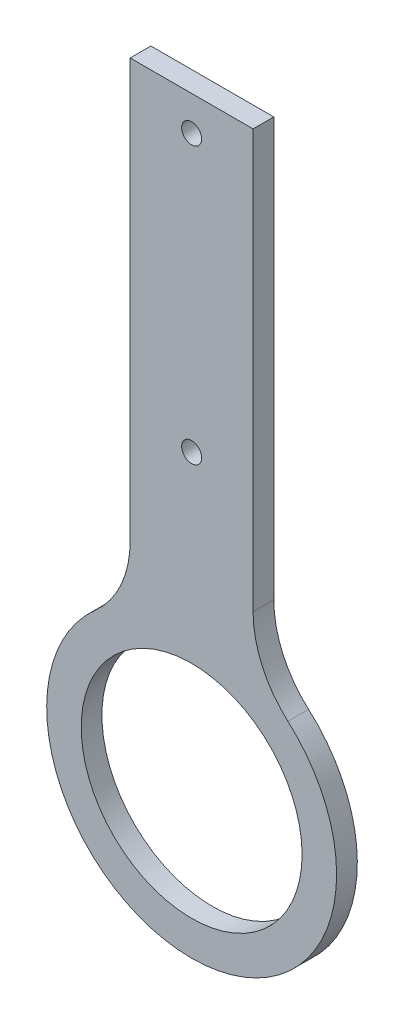
ISO-10303-21;
HEADER;
FILE_DESCRIPTION(('STEP AP214'),'2;1');
FILE_NAME('part.step','',(''),(''),'','','');
FILE_SCHEMA(('AUTOMOTIVE_DESIGN { 1 0 10303 214 1 1 1 1 }'));
ENDSEC;
DATA;
#1=APPLICATION_CONTEXT('core data for automotive mechanical design processes');
#2=APPLICATION_PROTOCOL_DEFINITION('international standard','automotive_design',2000,#1);
#3=PRODUCT_CONTEXT('',#1,'mechanical');
#4=PRODUCT('Part','Part','',(#3));
#5=PRODUCT_RELATED_PRODUCT_CATEGORY('part','',(#4));
#6=PRODUCT_DEFINITION_FORMATION('','',#4);
#7=PRODUCT_DEFINITION_CONTEXT('part definition',#1,'design');
#8=PRODUCT_DEFINITION('design','',#6,#7);
#9=PRODUCT_DEFINITION_SHAPE('','',#8);
#10=(LENGTH_UNIT() NAMED_UNIT(*) SI_UNIT(.MILLI.,.METRE.));
#11=(NAMED_UNIT(*) PLANE_ANGLE_UNIT() SI_UNIT($,.RADIAN.));
#12=(NAMED_UNIT(*) SI_UNIT($,.STERADIAN.) SOLID_ANGLE_UNIT());
#13=UNCERTAINTY_MEASURE_WITH_UNIT(LENGTH_MEASURE(1.E-05),#10,'distance_accuracy_value','');
#14=(GEOMETRIC_REPRESENTATION_CONTEXT(3) GLOBAL_UNCERTAINTY_ASSIGNED_CONTEXT((#13)) GLOBAL_UNIT_ASSIGNED_CONTEXT((#10,
#11,#12)) REPRESENTATION_CONTEXT('',''));
#15=CARTESIAN_POINT('',(0.,0.,0.));
#16=DIRECTION('',(0.,0.,1.));
#17=DIRECTION('',(1.,0.,0.));
#18=AXIS2_PLACEMENT_3D('',#15,#16,#17);
#19=CARTESIAN_POINT('',(0.,0.,3.));
#20=DIRECTION('',(0.,0.,-1.));
#21=DIRECTION('',(-1.,0.,0.));
#22=AXIS2_PLACEMENT_3D('',#19,#20,#21);
#23=CYLINDRICAL_SURFACE('',#22,21.);
#24=CARTESIAN_POINT('',(0.,0.,3.));
#25=DIRECTION('',(0.,0.,1.));
#26=DIRECTION('',(1.,0.,0.));
#27=AXIS2_PLACEMENT_3D('',#24,#25,#26);
#28=CIRCLE('',#27,21.);
#29=CARTESIAN_POINT('',(-13.9416666666667,15.7044557548345,3.));
#30=VERTEX_POINT('',#29);
#31=CARTESIAN_POINT('',(13.9416666666667,15.7044557548345,3.));
#32=VERTEX_POINT('',#31);
#33=EDGE_CURVE('E136',#30,#32,#28,.T.);
#34=ORIENTED_EDGE('',*,*,#33,.F.);
#35=DIRECTION('',(0.,0.,-1.));
#36=VECTOR('',#35,1.);
#37=CARTESIAN_POINT('',(-13.9416666666667,15.7044557548345,3.));
#38=LINE('',#37,#36);
#39=CARTESIAN_POINT('',(-13.9416666666667,15.7044557548345,0.));
#40=VERTEX_POINT('',#39);
#41=EDGE_CURVE('E149',#30,#40,#38,.T.);
#42=ORIENTED_EDGE('',*,*,#41,.T.);
#43=CARTESIAN_POINT('',(0.,0.,0.));
#44=DIRECTION('',(0.,0.,1.));
#45=DIRECTION('',(1.,0.,0.));
#46=AXIS2_PLACEMENT_3D('',#43,#44,#45);
#47=CIRCLE('',#46,21.);
#48=CARTESIAN_POINT('',(13.9416666666667,15.7044557548345,0.));
#49=VERTEX_POINT('',#48);
#50=EDGE_CURVE('E134',#40,#49,#47,.T.);
#51=ORIENTED_EDGE('',*,*,#50,.T.);
#52=DIRECTION('',(0.,0.,-1.));
#53=VECTOR('',#52,1.);
#54=CARTESIAN_POINT('',(13.9416666666667,15.7044557548345,3.));
#55=LINE('',#54,#53);
#56=EDGE_CURVE('E146',#49,#32,#55,.F.);
#57=ORIENTED_EDGE('',*,*,#56,.T.);
#58=EDGE_LOOP('',(#34,#42,#51,#57));
#59=FACE_BOUND('',#58,.T.);
#60=ADVANCED_FACE('F45',(#59),#23,.T.);
#61=CARTESIAN_POINT('',(0.,0.,3.));
#62=DIRECTION('',(0.,0.,-1.));
#63=DIRECTION('',(-1.,0.,0.));
#64=AXIS2_PLACEMENT_3D('',#61,#62,#63);
#65=CYLINDRICAL_SURFACE('',#64,16.);
#66=CARTESIAN_POINT('',(0.,0.,0.));
#67=DIRECTION('',(0.,0.,1.));
#68=DIRECTION('',(1.,0.,0.));
#69=AXIS2_PLACEMENT_3D('',#66,#67,#68);
#70=CIRCLE('',#69,16.);
#71=CARTESIAN_POINT('',(16.,0.,0.));
#72=VERTEX_POINT('',#71);
#73=EDGE_CURVE('E122',#72,#72,#70,.T.);
#74=ORIENTED_EDGE('',*,*,#73,.F.);
#75=EDGE_LOOP('',(#74));
#76=FACE_BOUND('',#75,.T.);
#77=CARTESIAN_POINT('',(0.,0.,3.));
#78=DIRECTION('',(0.,0.,1.));
#79=DIRECTION('',(1.,0.,0.));
#80=AXIS2_PLACEMENT_3D('',#77,#78,#79);
#81=CIRCLE('',#80,16.);
#82=CARTESIAN_POINT('',(16.,0.,3.));
#83=VERTEX_POINT('',#82);
#84=EDGE_CURVE('E127',#83,#83,#81,.T.);
#85=ORIENTED_EDGE('',*,*,#84,.T.);
#86=EDGE_LOOP('',(#85));
#87=FACE_BOUND('',#86,.T.);
#88=ADVANCED_FACE('F177',(#76,#87),#65,.F.);
#89=CARTESIAN_POINT('',(0.,0.,3.));
#90=DIRECTION('',(0.,0.,1.));
#91=DIRECTION('',(1.,0.,0.));
#92=AXIS2_PLACEMENT_3D('',#89,#90,#91);
#93=PLANE('',#92);
#94=ORIENTED_EDGE('',*,*,#84,.F.);
#95=EDGE_LOOP('',(#94));
#96=FACE_BOUND('',#95,.T.);
#97=DIRECTION('',(0.,-1.,0.));
#98=VECTOR('',#97,1.);
#99=CARTESIAN_POINT('',(-8.9,12.5,3.));
#100=LINE('',#99,#98);
#101=CARTESIAN_POINT('',(-8.9,87.5,3.));
#102=VERTEX_POINT('',#101);
#103=CARTESIAN_POINT('',(-8.9,26.9219241511449,3.));
#104=VERTEX_POINT('',#103);
#105=EDGE_CURVE('E115',#102,#104,#100,.T.);
#106=ORIENTED_EDGE('',*,*,#105,.T.);
#107=CARTESIAN_POINT('',(-23.9,26.9219241511449,3.));
#108=DIRECTION('',(0.,0.,1.));
#109=DIRECTION('',(1.,0.,0.));
#110=AXIS2_PLACEMENT_3D('',#107,#108,#109);
#111=CIRCLE('',#110,15.);
#112=EDGE_CURVE('E155',#104,#30,#111,.F.);
#113=ORIENTED_EDGE('',*,*,#112,.T.);
#114=ORIENTED_EDGE('',*,*,#33,.T.);
#115=CARTESIAN_POINT('',(23.9,26.9219241511449,3.));
#116=DIRECTION('',(0.,0.,1.));
#117=DIRECTION('',(1.,0.,0.));
#118=AXIS2_PLACEMENT_3D('',#115,#116,#117);
#119=CIRCLE('',#118,15.);
#120=CARTESIAN_POINT('',(8.9,26.9219241511449,3.));
#121=VERTEX_POINT('',#120);
#122=EDGE_CURVE('E11',#32,#121,#119,.F.);
#123=ORIENTED_EDGE('',*,*,#122,.T.);
#124=DIRECTION('',(0.,1.,0.));
#125=VECTOR('',#124,1.);
#126=CARTESIAN_POINT('',(8.9,12.5,3.));
#127=LINE('',#126,#125);
#128=CARTESIAN_POINT('',(8.9,87.5,3.));
#129=VERTEX_POINT('',#128);
#130=EDGE_CURVE('E95',#121,#129,#127,.T.);
#131=ORIENTED_EDGE('',*,*,#130,.T.);
#132=DIRECTION('',(-1.,0.,0.));
#133=VECTOR('',#132,1.);
#134=CARTESIAN_POINT('',(-8.9,87.5,3.));
#135=LINE('',#134,#133);
#136=EDGE_CURVE('E100',#129,#102,#135,.T.);
#137=ORIENTED_EDGE('',*,*,#136,.T.);
#138=EDGE_LOOP('',(#106,#113,#114,#123,#131,#137));
#139=FACE_BOUND('',#138,.T.);
#140=CARTESIAN_POINT('',(0.,42.5,3.));
#141=DIRECTION('',(0.,0.,1.));
#142=DIRECTION('',(1.,0.,0.));
#143=AXIS2_PLACEMENT_3D('',#140,#141,#142);
#144=CIRCLE('',#143,1.45);
#145=CARTESIAN_POINT('',(1.45,42.5,3.));
#146=VERTEX_POINT('',#145);
#147=EDGE_CURVE('E221',#146,#146,#144,.T.);
#148=ORIENTED_EDGE('',*,*,#147,.F.);
#149=EDGE_LOOP('',(#148));
#150=FACE_BOUND('',#149,.T.);
#151=CARTESIAN_POINT('',(0.,82.5,3.));
#152=DIRECTION('',(0.,0.,1.));
#153=DIRECTION('',(1.,0.,0.));
#154=AXIS2_PLACEMENT_3D('',#151,#152,#153);
#155=CIRCLE('',#154,1.45);
#156=CARTESIAN_POINT('',(1.45,82.5,3.));
#157=VERTEX_POINT('',#156);
#158=EDGE_CURVE('E210',#157,#157,#155,.T.);
#159=ORIENTED_EDGE('',*,*,#158,.F.);
#160=EDGE_LOOP('',(#159));
#161=FACE_BOUND('',#160,.T.);
#162=ADVANCED_FACE('F98',(#96,#139,#150,#161),#93,.T.);
#163=CARTESIAN_POINT('',(0.,0.,0.));
#164=DIRECTION('',(0.,0.,1.));
#165=DIRECTION('',(1.,0.,0.));
#166=AXIS2_PLACEMENT_3D('',#163,#164,#165);
#167=PLANE('',#166);
#168=ORIENTED_EDGE('',*,*,#73,.T.);
#169=EDGE_LOOP('',(#168));
#170=FACE_BOUND('',#169,.T.);
#171=DIRECTION('',(0.,1.,0.));
#172=VECTOR('',#171,1.);
#173=CARTESIAN_POINT('',(8.9,12.5,0.));
#174=LINE('',#173,#172);
#175=CARTESIAN_POINT('',(8.9,26.9219241511449,0.));
#176=VERTEX_POINT('',#175);
#177=CARTESIAN_POINT('',(8.9,87.5,0.));
#178=VERTEX_POINT('',#177);
#179=EDGE_CURVE('E119',#176,#178,#174,.T.);
#180=ORIENTED_EDGE('',*,*,#179,.F.);
#181=CARTESIAN_POINT('',(23.9,26.9219241511449,0.));
#182=DIRECTION('',(0.,0.,1.));
#183=DIRECTION('',(1.,0.,0.));
#184=AXIS2_PLACEMENT_3D('',#181,#182,#183);
#185=CIRCLE('',#184,15.);
#186=EDGE_CURVE('E54',#176,#49,#185,.T.);
#187=ORIENTED_EDGE('',*,*,#186,.T.);
#188=ORIENTED_EDGE('',*,*,#50,.F.);
#189=CARTESIAN_POINT('',(-23.9,26.9219241511449,0.));
#190=DIRECTION('',(0.,0.,1.));
#191=DIRECTION('',(1.,0.,0.));
#192=AXIS2_PLACEMENT_3D('',#189,#190,#191);
#193=CIRCLE('',#192,15.);
#194=CARTESIAN_POINT('',(-8.9,26.9219241511449,0.));
#195=VERTEX_POINT('',#194);
#196=EDGE_CURVE('E158',#40,#195,#193,.T.);
#197=ORIENTED_EDGE('',*,*,#196,.T.);
#198=DIRECTION('',(0.,-1.,0.));
#199=VECTOR('',#198,1.);
#200=CARTESIAN_POINT('',(-8.9,12.5,0.));
#201=LINE('',#200,#199);
#202=CARTESIAN_POINT('',(-8.9,87.5,0.));
#203=VERTEX_POINT('',#202);
#204=EDGE_CURVE('E105',#203,#195,#201,.T.);
#205=ORIENTED_EDGE('',*,*,#204,.F.);
#206=DIRECTION('',(-1.,0.,0.));
#207=VECTOR('',#206,1.);
#208=CARTESIAN_POINT('',(-8.9,87.5,0.));
#209=LINE('',#208,#207);
#210=EDGE_CURVE('E232',#178,#203,#209,.T.);
#211=ORIENTED_EDGE('',*,*,#210,.F.);
#212=EDGE_LOOP('',(#180,#187,#188,#197,#205,#211));
#213=FACE_BOUND('',#212,.T.);
#214=CARTESIAN_POINT('',(0.,42.5,0.));
#215=DIRECTION('',(0.,0.,1.));
#216=DIRECTION('',(1.,0.,0.));
#217=AXIS2_PLACEMENT_3D('',#214,#215,#216);
#218=CIRCLE('',#217,1.45);
#219=CARTESIAN_POINT('',(1.45,42.5,0.));
#220=VERTEX_POINT('',#219);
#221=EDGE_CURVE('E218',#220,#220,#218,.T.);
#222=ORIENTED_EDGE('',*,*,#221,.T.);
#223=EDGE_LOOP('',(#222));
#224=FACE_BOUND('',#223,.T.);
#225=CARTESIAN_POINT('',(0.,82.5,0.));
#226=DIRECTION('',(0.,0.,1.));
#227=DIRECTION('',(1.,0.,0.));
#228=AXIS2_PLACEMENT_3D('',#225,#226,#227);
#229=CIRCLE('',#228,1.45);
#230=CARTESIAN_POINT('',(1.45,82.5,0.));
#231=VERTEX_POINT('',#230);
#232=EDGE_CURVE('E213',#231,#231,#229,.T.);
#233=ORIENTED_EDGE('',*,*,#232,.T.);
#234=EDGE_LOOP('',(#233));
#235=FACE_BOUND('',#234,.T.);
#236=ADVANCED_FACE('F163',(#170,#213,#224,#235),#167,.F.);
#237=CARTESIAN_POINT('',(8.9,12.5,3.));
#238=DIRECTION('',(-1.,0.,0.));
#239=DIRECTION('',(0.,0.,1.));
#240=AXIS2_PLACEMENT_3D('',#237,#238,#239);
#241=PLANE('',#240);
#242=ORIENTED_EDGE('',*,*,#130,.F.);
#243=DIRECTION('',(0.,0.,1.));
#244=VECTOR('',#243,1.);
#245=CARTESIAN_POINT('',(8.9,26.9219241511449,0.));
#246=LINE('',#245,#244);
#247=EDGE_CURVE('E152',#121,#176,#246,.F.);
#248=ORIENTED_EDGE('',*,*,#247,.T.);
#249=ORIENTED_EDGE('',*,*,#179,.T.);
#250=DIRECTION('',(0.,0.,-1.));
#251=VECTOR('',#250,1.);
#252=CARTESIAN_POINT('',(8.9,87.5,3.));
#253=LINE('',#252,#251);
#254=EDGE_CURVE('E110',#129,#178,#253,.T.);
#255=ORIENTED_EDGE('',*,*,#254,.F.);
#256=EDGE_LOOP('',(#242,#248,#249,#255));
#257=FACE_BOUND('',#256,.T.);
#258=ADVANCED_FACE('F117',(#257),#241,.F.);
#259=CARTESIAN_POINT('',(-8.9,12.5,3.));
#260=DIRECTION('',(1.,0.,0.));
#261=DIRECTION('',(0.,0.,-1.));
#262=AXIS2_PLACEMENT_3D('',#259,#260,#261);
#263=PLANE('',#262);
#264=ORIENTED_EDGE('',*,*,#204,.T.);
#265=DIRECTION('',(0.,0.,1.));
#266=VECTOR('',#265,1.);
#267=CARTESIAN_POINT('',(-8.9,26.9219241511449,3.));
#268=LINE('',#267,#266);
#269=EDGE_CURVE('E139',#195,#104,#268,.T.);
#270=ORIENTED_EDGE('',*,*,#269,.T.);
#271=ORIENTED_EDGE('',*,*,#105,.F.);
#272=DIRECTION('',(0.,0.,-1.));
#273=VECTOR('',#272,1.);
#274=CARTESIAN_POINT('',(-8.9,87.5,3.));
#275=LINE('',#274,#273);
#276=EDGE_CURVE('E112',#102,#203,#275,.T.);
#277=ORIENTED_EDGE('',*,*,#276,.T.);
#278=EDGE_LOOP('',(#264,#270,#271,#277));
#279=FACE_BOUND('',#278,.T.);
#280=ADVANCED_FACE('F193',(#279),#263,.F.);
#281=CARTESIAN_POINT('',(-8.9,87.5,3.));
#282=DIRECTION('',(0.,-1.,0.));
#283=DIRECTION('',(0.,0.,-1.));
#284=AXIS2_PLACEMENT_3D('',#281,#282,#283);
#285=PLANE('',#284);
#286=ORIENTED_EDGE('',*,*,#210,.T.);
#287=ORIENTED_EDGE('',*,*,#276,.F.);
#288=ORIENTED_EDGE('',*,*,#136,.F.);
#289=ORIENTED_EDGE('',*,*,#254,.T.);
#290=EDGE_LOOP('',(#286,#287,#288,#289));
#291=FACE_BOUND('',#290,.T.);
#292=ADVANCED_FACE('F109',(#291),#285,.F.);
#293=CARTESIAN_POINT('',(0.,42.5,3.));
#294=DIRECTION('',(0.,0.,-1.));
#295=DIRECTION('',(-1.,0.,0.));
#296=AXIS2_PLACEMENT_3D('',#293,#294,#295);
#297=CYLINDRICAL_SURFACE('',#296,1.45);
#298=ORIENTED_EDGE('',*,*,#147,.T.);
#299=EDGE_LOOP('',(#298));
#300=FACE_BOUND('',#299,.T.);
#301=ORIENTED_EDGE('',*,*,#221,.F.);
#302=EDGE_LOOP('',(#301));
#303=FACE_BOUND('',#302,.T.);
#304=ADVANCED_FACE('F196',(#300,#303),#297,.F.);
#305=CARTESIAN_POINT('',(0.,82.5,3.));
#306=DIRECTION('',(0.,0.,-1.));
#307=DIRECTION('',(-1.,0.,0.));
#308=AXIS2_PLACEMENT_3D('',#305,#306,#307);
#309=CYLINDRICAL_SURFACE('',#308,1.45);
#310=ORIENTED_EDGE('',*,*,#158,.T.);
#311=EDGE_LOOP('',(#310));
#312=FACE_BOUND('',#311,.T.);
#313=ORIENTED_EDGE('',*,*,#232,.F.);
#314=EDGE_LOOP('',(#313));
#315=FACE_BOUND('',#314,.T.);
#316=ADVANCED_FACE('F174',(#312,#315),#309,.F.);
#317=CARTESIAN_POINT('',(-23.9,26.9219241511449,3.));
#318=DIRECTION('',(0.,0.,-1.));
#319=DIRECTION('',(-1.,0.,0.));
#320=AXIS2_PLACEMENT_3D('',#317,#318,#319);
#321=CYLINDRICAL_SURFACE('',#320,15.);
#322=ORIENTED_EDGE('',*,*,#196,.F.);
#323=ORIENTED_EDGE('',*,*,#41,.F.);
#324=ORIENTED_EDGE('',*,*,#112,.F.);
#325=ORIENTED_EDGE('',*,*,#269,.F.);
#326=EDGE_LOOP('',(#322,#323,#324,#325));
#327=FACE_BOUND('',#326,.T.);
#328=ADVANCED_FACE('F170',(#327),#321,.F.);
#329=CARTESIAN_POINT('',(23.9,26.9219241511449,3.));
#330=DIRECTION('',(0.,0.,-1.));
#331=DIRECTION('',(-1.,0.,0.));
#332=AXIS2_PLACEMENT_3D('',#329,#330,#331);
#333=CYLINDRICAL_SURFACE('',#332,15.);
#334=ORIENTED_EDGE('',*,*,#122,.F.);
#335=ORIENTED_EDGE('',*,*,#56,.F.);
#336=ORIENTED_EDGE('',*,*,#186,.F.);
#337=ORIENTED_EDGE('',*,*,#247,.F.);
#338=EDGE_LOOP('',(#334,#335,#336,#337));
#339=FACE_BOUND('',#338,.T.);
#340=ADVANCED_FACE('F47',(#339),#333,.F.);
#341=CLOSED_SHELL('',(#60,#88,#162,#236,#258,#280,#292,#304,#316,#328,#340));
#342=MANIFOLD_SOLID_BREP('B2',#341);
#343=ADVANCED_BREP_SHAPE_REPRESENTATION('',(#18,#342),#14);
#344=SHAPE_DEFINITION_REPRESENTATION(#9,#343);
ENDSEC;
END-ISO-10303-21;
